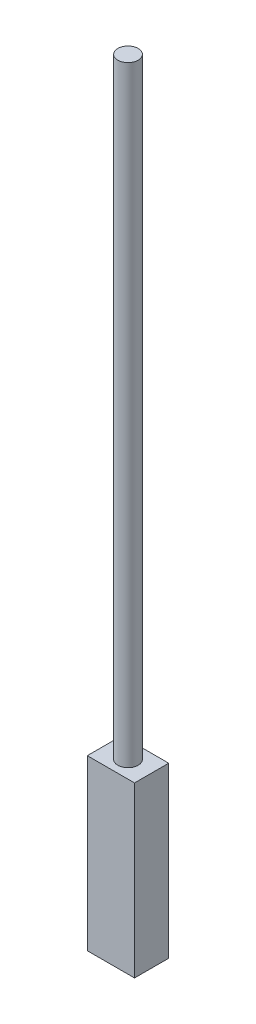
ISO-10303-21;
HEADER;
FILE_DESCRIPTION(('STEP AP214'),'2;1');
FILE_NAME('part.step','',(''),(''),'','','');
FILE_SCHEMA(('AUTOMOTIVE_DESIGN { 1 0 10303 214 1 1 1 1 }'));
ENDSEC;
DATA;
#1=APPLICATION_CONTEXT('core data for automotive mechanical design processes');
#2=APPLICATION_PROTOCOL_DEFINITION('international standard','automotive_design',2000,#1);
#3=PRODUCT_CONTEXT('',#1,'mechanical');
#4=PRODUCT('Part','Part','',(#3));
#5=PRODUCT_RELATED_PRODUCT_CATEGORY('part','',(#4));
#6=PRODUCT_DEFINITION_FORMATION('','',#4);
#7=PRODUCT_DEFINITION_CONTEXT('part definition',#1,'design');
#8=PRODUCT_DEFINITION('design','',#6,#7);
#9=PRODUCT_DEFINITION_SHAPE('','',#8);
#10=(LENGTH_UNIT() NAMED_UNIT(*) SI_UNIT(.MILLI.,.METRE.));
#11=(NAMED_UNIT(*) PLANE_ANGLE_UNIT() SI_UNIT($,.RADIAN.));
#12=(NAMED_UNIT(*) SI_UNIT($,.STERADIAN.) SOLID_ANGLE_UNIT());
#13=UNCERTAINTY_MEASURE_WITH_UNIT(LENGTH_MEASURE(1.E-05),#10,'distance_accuracy_value','');
#14=(GEOMETRIC_REPRESENTATION_CONTEXT(3) GLOBAL_UNCERTAINTY_ASSIGNED_CONTEXT((#13)) GLOBAL_UNIT_ASSIGNED_CONTEXT((#10,
#11,#12)) REPRESENTATION_CONTEXT('',''));
#15=CARTESIAN_POINT('',(0.,0.,0.));
#16=DIRECTION('',(0.,0.,1.));
#17=DIRECTION('',(1.,0.,0.));
#18=AXIS2_PLACEMENT_3D('',#15,#16,#17);
#19=CARTESIAN_POINT('',(0.,-191.5,0.));
#20=DIRECTION('',(0.,-1.,0.));
#21=DIRECTION('',(0.,0.,-1.));
#22=AXIS2_PLACEMENT_3D('',#19,#20,#21);
#23=PLANE('',#22);
#24=DIRECTION('',(0.,0.,-1.));
#25=VECTOR('',#24,1.);
#26=CARTESIAN_POINT('',(-5.8,-191.5,0.));
#27=LINE('',#26,#25);
#28=CARTESIAN_POINT('',(-5.8,-191.5,4.2));
#29=VERTEX_POINT('',#28);
#30=CARTESIAN_POINT('',(-5.8,-191.5,-4.2));
#31=VERTEX_POINT('',#30);
#32=EDGE_CURVE('E56',#29,#31,#27,.T.);
#33=ORIENTED_EDGE('',*,*,#32,.T.);
#34=DIRECTION('',(-1.,0.,0.));
#35=VECTOR('',#34,1.);
#36=CARTESIAN_POINT('',(0.,-191.5,-4.2));
#37=LINE('',#36,#35);
#38=CARTESIAN_POINT('',(5.8,-191.5,-4.2));
#39=VERTEX_POINT('',#38);
#40=EDGE_CURVE('E77',#39,#31,#37,.T.);
#41=ORIENTED_EDGE('',*,*,#40,.F.);
#42=DIRECTION('',(0.,0.,-1.));
#43=VECTOR('',#42,1.);
#44=CARTESIAN_POINT('',(5.8,-191.5,0.));
#45=LINE('',#44,#43);
#46=CARTESIAN_POINT('',(5.8,-191.5,4.2));
#47=VERTEX_POINT('',#46);
#48=EDGE_CURVE('E62',#47,#39,#45,.T.);
#49=ORIENTED_EDGE('',*,*,#48,.F.);
#50=DIRECTION('',(-1.,0.,0.));
#51=VECTOR('',#50,1.);
#52=CARTESIAN_POINT('',(0.,-191.5,4.2));
#53=LINE('',#52,#51);
#54=EDGE_CURVE('E59',#47,#29,#53,.T.);
#55=ORIENTED_EDGE('',*,*,#54,.T.);
#56=EDGE_LOOP('',(#33,#41,#49,#55));
#57=FACE_BOUND('',#56,.T.);
#58=ADVANCED_FACE('F17',(#57),#23,.T.);
#59=CARTESIAN_POINT('',(0.,-191.5,4.2));
#60=DIRECTION('',(0.,0.,-1.));
#61=DIRECTION('',(-1.,0.,0.));
#62=AXIS2_PLACEMENT_3D('',#59,#60,#61);
#63=PLANE('',#62);
#64=DIRECTION('',(0.,1.,0.));
#65=VECTOR('',#64,1.);
#66=CARTESIAN_POINT('',(-5.8,-191.5,4.2));
#67=LINE('',#66,#65);
#68=CARTESIAN_POINT('',(-5.8,-150.,4.2));
#69=VERTEX_POINT('',#68);
#70=EDGE_CURVE('E65',#69,#29,#67,.F.);
#71=ORIENTED_EDGE('',*,*,#70,.T.);
#72=ORIENTED_EDGE('',*,*,#54,.F.);
#73=DIRECTION('',(0.,1.,0.));
#74=VECTOR('',#73,1.);
#75=CARTESIAN_POINT('',(5.8,-191.5,4.2));
#76=LINE('',#75,#74);
#77=CARTESIAN_POINT('',(5.8,-150.,4.2));
#78=VERTEX_POINT('',#77);
#79=EDGE_CURVE('E99',#78,#47,#76,.F.);
#80=ORIENTED_EDGE('',*,*,#79,.F.);
#81=DIRECTION('',(1.,0.,0.));
#82=VECTOR('',#81,1.);
#83=CARTESIAN_POINT('',(0.,-150.,4.2));
#84=LINE('',#83,#82);
#85=EDGE_CURVE('E70',#78,#69,#84,.F.);
#86=ORIENTED_EDGE('',*,*,#85,.T.);
#87=EDGE_LOOP('',(#71,#72,#80,#86));
#88=FACE_BOUND('',#87,.T.);
#89=ADVANCED_FACE('F68',(#88),#63,.F.);
#90=CARTESIAN_POINT('',(-5.8,-191.5,0.));
#91=DIRECTION('',(1.,0.,0.));
#92=DIRECTION('',(0.,0.,-1.));
#93=AXIS2_PLACEMENT_3D('',#90,#91,#92);
#94=PLANE('',#93);
#95=DIRECTION('',(0.,1.,0.));
#96=VECTOR('',#95,1.);
#97=CARTESIAN_POINT('',(-5.8,-191.5,-4.2));
#98=LINE('',#97,#96);
#99=CARTESIAN_POINT('',(-5.8,-150.,-4.2));
#100=VERTEX_POINT('',#99);
#101=EDGE_CURVE('E75',#31,#100,#98,.T.);
#102=ORIENTED_EDGE('',*,*,#101,.F.);
#103=ORIENTED_EDGE('',*,*,#32,.F.);
#104=ORIENTED_EDGE('',*,*,#70,.F.);
#105=DIRECTION('',(0.,0.,-1.));
#106=VECTOR('',#105,1.);
#107=CARTESIAN_POINT('',(-5.8,-150.,0.));
#108=LINE('',#107,#106);
#109=EDGE_CURVE('E91',#69,#100,#108,.T.);
#110=ORIENTED_EDGE('',*,*,#109,.T.);
#111=EDGE_LOOP('',(#102,#103,#104,#110));
#112=FACE_BOUND('',#111,.T.);
#113=ADVANCED_FACE('F74',(#112),#94,.F.);
#114=CARTESIAN_POINT('',(0.,-191.5,-4.2));
#115=DIRECTION('',(0.,0.,-1.));
#116=DIRECTION('',(-1.,0.,0.));
#117=AXIS2_PLACEMENT_3D('',#114,#115,#116);
#118=PLANE('',#117);
#119=ORIENTED_EDGE('',*,*,#40,.T.);
#120=ORIENTED_EDGE('',*,*,#101,.T.);
#121=DIRECTION('',(1.,0.,0.));
#122=VECTOR('',#121,1.);
#123=CARTESIAN_POINT('',(0.,-150.,-4.2));
#124=LINE('',#123,#122);
#125=CARTESIAN_POINT('',(5.8,-150.,-4.2));
#126=VERTEX_POINT('',#125);
#127=EDGE_CURVE('E35',#100,#126,#124,.T.);
#128=ORIENTED_EDGE('',*,*,#127,.T.);
#129=DIRECTION('',(0.,1.,0.));
#130=VECTOR('',#129,1.);
#131=CARTESIAN_POINT('',(5.8,-191.5,-4.2));
#132=LINE('',#131,#130);
#133=EDGE_CURVE('E96',#39,#126,#132,.T.);
#134=ORIENTED_EDGE('',*,*,#133,.F.);
#135=EDGE_LOOP('',(#119,#120,#128,#134));
#136=FACE_BOUND('',#135,.T.);
#137=ADVANCED_FACE('F100',(#136),#118,.T.);
#138=CARTESIAN_POINT('',(5.8,-191.5,0.));
#139=DIRECTION('',(1.,0.,0.));
#140=DIRECTION('',(0.,0.,-1.));
#141=AXIS2_PLACEMENT_3D('',#138,#139,#140);
#142=PLANE('',#141);
#143=ORIENTED_EDGE('',*,*,#48,.T.);
#144=ORIENTED_EDGE('',*,*,#133,.T.);
#145=DIRECTION('',(0.,0.,-1.));
#146=VECTOR('',#145,1.);
#147=CARTESIAN_POINT('',(5.8,-150.,0.));
#148=LINE('',#147,#146);
#149=EDGE_CURVE('E84',#126,#78,#148,.F.);
#150=ORIENTED_EDGE('',*,*,#149,.T.);
#151=ORIENTED_EDGE('',*,*,#79,.T.);
#152=EDGE_LOOP('',(#143,#144,#150,#151));
#153=FACE_BOUND('',#152,.T.);
#154=ADVANCED_FACE('F106',(#153),#142,.T.);
#155=CARTESIAN_POINT('',(0.,-150.,0.));
#156=DIRECTION('',(0.,-1.,0.));
#157=DIRECTION('',(0.,0.,-1.));
#158=AXIS2_PLACEMENT_3D('',#155,#156,#157);
#159=PLANE('',#158);
#160=ORIENTED_EDGE('',*,*,#127,.F.);
#161=ORIENTED_EDGE('',*,*,#109,.F.);
#162=ORIENTED_EDGE('',*,*,#85,.F.);
#163=ORIENTED_EDGE('',*,*,#149,.F.);
#164=EDGE_LOOP('',(#160,#161,#162,#163));
#165=FACE_BOUND('',#164,.T.);
#166=CARTESIAN_POINT('',(0.,-150.,0.));
#167=DIRECTION('',(0.,1.,0.));
#168=DIRECTION('',(0.,0.,1.));
#169=AXIS2_PLACEMENT_3D('',#166,#167,#168);
#170=CIRCLE('',#169,2.5);
#171=CARTESIAN_POINT('',(0.,-150.,2.5));
#172=VERTEX_POINT('',#171);
#173=EDGE_CURVE('E26',#172,#172,#170,.T.);
#174=ORIENTED_EDGE('',*,*,#173,.F.);
#175=EDGE_LOOP('',(#174));
#176=FACE_BOUND('',#175,.T.);
#177=ADVANCED_FACE('F102',(#165,#176),#159,.F.);
#178=CARTESIAN_POINT('',(0.,0.,0.));
#179=DIRECTION('',(0.,-1.,0.));
#180=DIRECTION('',(0.,0.,-1.));
#181=AXIS2_PLACEMENT_3D('',#178,#179,#180);
#182=PLANE('',#181);
#183=CARTESIAN_POINT('',(0.,0.,0.));
#184=DIRECTION('',(0.,1.,0.));
#185=DIRECTION('',(0.,0.,1.));
#186=AXIS2_PLACEMENT_3D('',#183,#184,#185);
#187=CIRCLE('',#186,2.5);
#188=CARTESIAN_POINT('',(0.,0.,2.5));
#189=VERTEX_POINT('',#188);
#190=EDGE_CURVE('E11',#189,#189,#187,.F.);
#191=ORIENTED_EDGE('',*,*,#190,.F.);
#192=EDGE_LOOP('',(#191));
#193=FACE_BOUND('',#192,.T.);
#194=ADVANCED_FACE('F105',(#193),#182,.F.);
#195=CARTESIAN_POINT('',(0.,-150.,0.));
#196=DIRECTION('',(0.,1.,0.));
#197=DIRECTION('',(0.,0.,1.));
#198=AXIS2_PLACEMENT_3D('',#195,#196,#197);
#199=CYLINDRICAL_SURFACE('',#198,2.5);
#200=ORIENTED_EDGE('',*,*,#190,.T.);
#201=EDGE_LOOP('',(#200));
#202=FACE_BOUND('',#201,.T.);
#203=ORIENTED_EDGE('',*,*,#173,.T.);
#204=EDGE_LOOP('',(#203));
#205=FACE_BOUND('',#204,.T.);
#206=ADVANCED_FACE('F113',(#202,#205),#199,.T.);
#207=CLOSED_SHELL('',(#58,#89,#113,#137,#154,#177,#194,#206));
#208=MANIFOLD_SOLID_BREP('B1',#207);
#209=ADVANCED_BREP_SHAPE_REPRESENTATION('',(#18,#208),#14);
#210=SHAPE_DEFINITION_REPRESENTATION(#9,#209);
ENDSEC;
END-ISO-10303-21;
